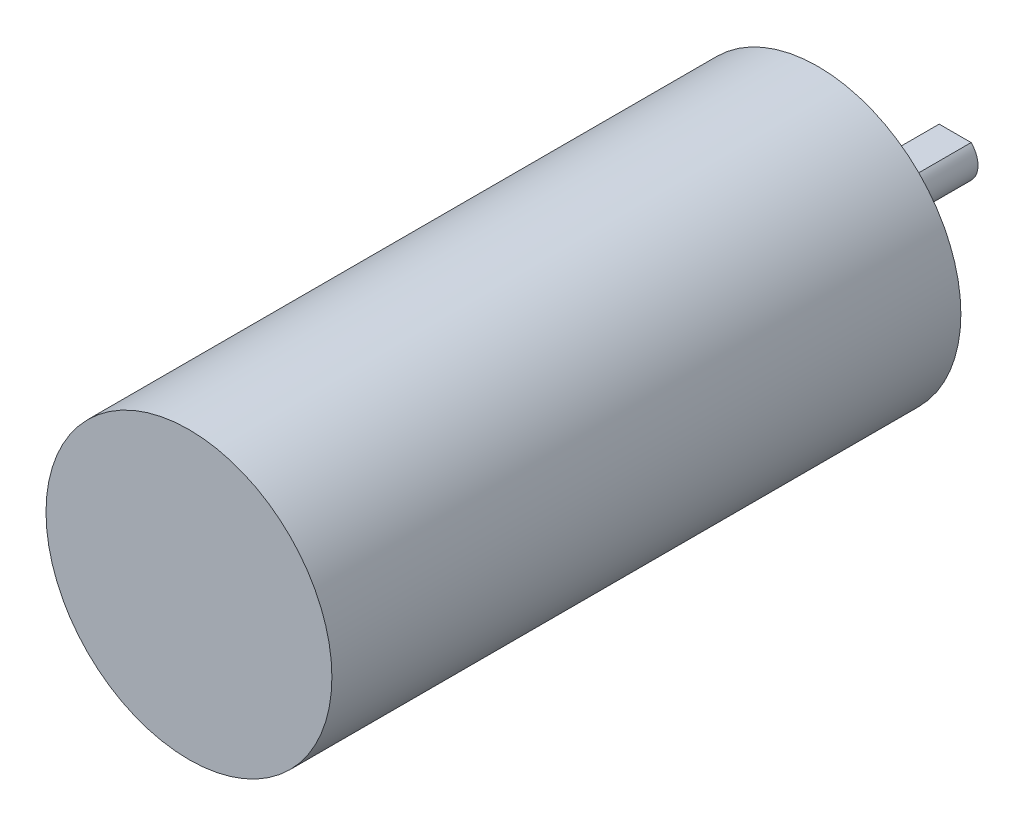
ISO-10303-21;
HEADER;
FILE_DESCRIPTION(('STEP AP214'),'2;1');
FILE_NAME('part.step','',(''),(''),'','','');
FILE_SCHEMA(('AUTOMOTIVE_DESIGN { 1 0 10303 214 1 1 1 1 }'));
ENDSEC;
DATA;
#1=APPLICATION_CONTEXT('core data for automotive mechanical design processes');
#2=APPLICATION_PROTOCOL_DEFINITION('international standard','automotive_design',2000,#1);
#3=PRODUCT_CONTEXT('',#1,'mechanical');
#4=PRODUCT('Part','Part','',(#3));
#5=PRODUCT_RELATED_PRODUCT_CATEGORY('part','',(#4));
#6=PRODUCT_DEFINITION_FORMATION('','',#4);
#7=PRODUCT_DEFINITION_CONTEXT('part definition',#1,'design');
#8=PRODUCT_DEFINITION('design','',#6,#7);
#9=PRODUCT_DEFINITION_SHAPE('','',#8);
#10=(LENGTH_UNIT() NAMED_UNIT(*) SI_UNIT(.MILLI.,.METRE.));
#11=(NAMED_UNIT(*) PLANE_ANGLE_UNIT() SI_UNIT($,.RADIAN.));
#12=(NAMED_UNIT(*) SI_UNIT($,.STERADIAN.) SOLID_ANGLE_UNIT());
#13=UNCERTAINTY_MEASURE_WITH_UNIT(LENGTH_MEASURE(1.E-05),#10,'distance_accuracy_value','');
#14=(GEOMETRIC_REPRESENTATION_CONTEXT(3) GLOBAL_UNCERTAINTY_ASSIGNED_CONTEXT((#13)) GLOBAL_UNIT_ASSIGNED_CONTEXT((#10,
#11,#12)) REPRESENTATION_CONTEXT('',''));
#15=CARTESIAN_POINT('',(0.,0.,0.));
#16=DIRECTION('',(0.,0.,1.));
#17=DIRECTION('',(1.,0.,0.));
#18=AXIS2_PLACEMENT_3D('',#15,#16,#17);
#19=CARTESIAN_POINT('',(0.,0.,0.));
#20=DIRECTION('',(0.,0.,1.));
#21=DIRECTION('',(1.,0.,0.));
#22=AXIS2_PLACEMENT_3D('',#19,#20,#21);
#23=PLANE('',#22);
#24=CARTESIAN_POINT('',(0.,0.,0.));
#25=DIRECTION('',(0.,0.,1.));
#26=DIRECTION('',(1.,0.,0.));
#27=AXIS2_PLACEMENT_3D('',#24,#25,#26);
#28=CIRCLE('',#27,12.5);
#29=CARTESIAN_POINT('',(12.5,0.,0.));
#30=VERTEX_POINT('',#29);
#31=EDGE_CURVE('E37',#30,#30,#28,.T.);
#32=ORIENTED_EDGE('',*,*,#31,.F.);
#33=EDGE_LOOP('',(#32));
#34=FACE_BOUND('',#33,.T.);
#35=CARTESIAN_POINT('',(0.,0.,0.));
#36=DIRECTION('',(0.,0.,-1.));
#37=DIRECTION('',(-1.,0.,0.));
#38=AXIS2_PLACEMENT_3D('',#35,#36,#37);
#39=CIRCLE('',#38,2.);
#40=CARTESIAN_POINT('',(1.39824890488067,1.43,0.));
#41=VERTEX_POINT('',#40);
#42=CARTESIAN_POINT('',(-1.39824890488067,1.43,0.));
#43=VERTEX_POINT('',#42);
#44=EDGE_CURVE('E60',#41,#43,#39,.T.);
#45=ORIENTED_EDGE('',*,*,#44,.F.);
#46=DIRECTION('',(1.,0.,0.));
#47=VECTOR('',#46,1.);
#48=CARTESIAN_POINT('',(1.39824890488067,1.43,0.));
#49=LINE('',#48,#47);
#50=EDGE_CURVE('E47',#43,#41,#49,.T.);
#51=ORIENTED_EDGE('',*,*,#50,.F.);
#52=EDGE_LOOP('',(#45,#51));
#53=FACE_BOUND('',#52,.T.);
#54=ADVANCED_FACE('F33',(#34,#53),#23,.F.);
#55=CARTESIAN_POINT('',(0.,0.,55.));
#56=DIRECTION('',(0.,0.,-1.));
#57=DIRECTION('',(-1.,0.,0.));
#58=AXIS2_PLACEMENT_3D('',#55,#56,#57);
#59=CYLINDRICAL_SURFACE('',#58,12.5);
#60=CARTESIAN_POINT('',(0.,0.,55.));
#61=DIRECTION('',(0.,0.,1.));
#62=DIRECTION('',(1.,0.,0.));
#63=AXIS2_PLACEMENT_3D('',#60,#61,#62);
#64=CIRCLE('',#63,12.5);
#65=CARTESIAN_POINT('',(12.5,0.,55.));
#66=VERTEX_POINT('',#65);
#67=EDGE_CURVE('E11',#66,#66,#64,.T.);
#68=ORIENTED_EDGE('',*,*,#67,.F.);
#69=EDGE_LOOP('',(#68));
#70=FACE_BOUND('',#69,.T.);
#71=ORIENTED_EDGE('',*,*,#31,.T.);
#72=EDGE_LOOP('',(#71));
#73=FACE_BOUND('',#72,.T.);
#74=ADVANCED_FACE('F35',(#70,#73),#59,.T.);
#75=CARTESIAN_POINT('',(0.,0.,55.));
#76=DIRECTION('',(0.,0.,1.));
#77=DIRECTION('',(1.,0.,0.));
#78=AXIS2_PLACEMENT_3D('',#75,#76,#77);
#79=PLANE('',#78);
#80=ORIENTED_EDGE('',*,*,#67,.T.);
#81=EDGE_LOOP('',(#80));
#82=FACE_BOUND('',#81,.T.);
#83=ADVANCED_FACE('F89',(#82),#79,.T.);
#84=CARTESIAN_POINT('',(0.,0.,-12.));
#85=DIRECTION('',(0.,0.,1.));
#86=DIRECTION('',(1.,0.,0.));
#87=AXIS2_PLACEMENT_3D('',#84,#85,#86);
#88=CYLINDRICAL_SURFACE('',#87,2.);
#89=ORIENTED_EDGE('',*,*,#44,.T.);
#90=DIRECTION('',(0.,0.,1.));
#91=VECTOR('',#90,1.);
#92=CARTESIAN_POINT('',(-1.39824890488067,1.43,-12.));
#93=LINE('',#92,#91);
#94=CARTESIAN_POINT('',(-1.39824890488067,1.43,-12.));
#95=VERTEX_POINT('',#94);
#96=EDGE_CURVE('E69',#95,#43,#93,.T.);
#97=ORIENTED_EDGE('',*,*,#96,.F.);
#98=CARTESIAN_POINT('',(0.,0.,-12.));
#99=DIRECTION('',(0.,0.,-1.));
#100=DIRECTION('',(-1.,0.,0.));
#101=AXIS2_PLACEMENT_3D('',#98,#99,#100);
#102=CIRCLE('',#101,2.);
#103=CARTESIAN_POINT('',(1.39824890488067,1.43,-12.));
#104=VERTEX_POINT('',#103);
#105=EDGE_CURVE('E70',#104,#95,#102,.T.);
#106=ORIENTED_EDGE('',*,*,#105,.F.);
#107=DIRECTION('',(0.,0.,1.));
#108=VECTOR('',#107,1.);
#109=CARTESIAN_POINT('',(1.39824890488067,1.43,-12.));
#110=LINE('',#109,#108);
#111=EDGE_CURVE('E67',#104,#41,#110,.T.);
#112=ORIENTED_EDGE('',*,*,#111,.T.);
#113=EDGE_LOOP('',(#89,#97,#106,#112));
#114=FACE_BOUND('',#113,.T.);
#115=ADVANCED_FACE('F72',(#114),#88,.T.);
#116=CARTESIAN_POINT('',(1.39824890488067,1.43,-12.));
#117=DIRECTION('',(0.,-1.,0.));
#118=DIRECTION('',(0.,0.,-1.));
#119=AXIS2_PLACEMENT_3D('',#116,#117,#118);
#120=PLANE('',#119);
#121=ORIENTED_EDGE('',*,*,#50,.T.);
#122=ORIENTED_EDGE('',*,*,#111,.F.);
#123=DIRECTION('',(1.,0.,0.));
#124=VECTOR('',#123,1.);
#125=CARTESIAN_POINT('',(1.39824890488067,1.43,-12.));
#126=LINE('',#125,#124);
#127=EDGE_CURVE('E55',#95,#104,#126,.T.);
#128=ORIENTED_EDGE('',*,*,#127,.F.);
#129=ORIENTED_EDGE('',*,*,#96,.T.);
#130=EDGE_LOOP('',(#121,#122,#128,#129));
#131=FACE_BOUND('',#130,.T.);
#132=ADVANCED_FACE('F66',(#131),#120,.F.);
#133=CARTESIAN_POINT('',(0.,0.,-12.));
#134=DIRECTION('',(0.,0.,-1.));
#135=DIRECTION('',(-1.,0.,0.));
#136=AXIS2_PLACEMENT_3D('',#133,#134,#135);
#137=PLANE('',#136);
#138=ORIENTED_EDGE('',*,*,#105,.T.);
#139=ORIENTED_EDGE('',*,*,#127,.T.);
#140=EDGE_LOOP('',(#138,#139));
#141=FACE_BOUND('',#140,.T.);
#142=ADVANCED_FACE('F77',(#141),#137,.T.);
#143=CLOSED_SHELL('',(#54,#74,#83,#115,#132,#142));
#144=MANIFOLD_SOLID_BREP('B2',#143);
#145=ADVANCED_BREP_SHAPE_REPRESENTATION('',(#18,#144),#14);
#146=SHAPE_DEFINITION_REPRESENTATION(#9,#145);
ENDSEC;
END-ISO-10303-21;
